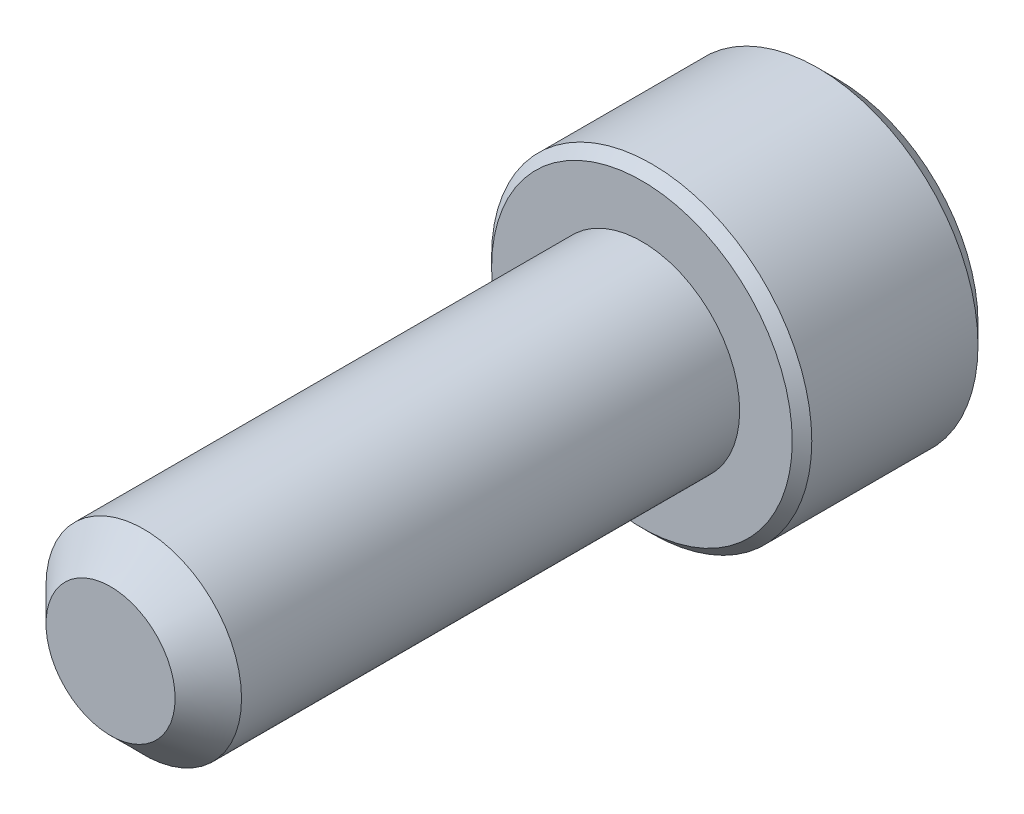
ISO-10303-21;
HEADER;
FILE_DESCRIPTION(('STEP AP214'),'2;1');
FILE_NAME('part.step','',(''),(''),'','','');
FILE_SCHEMA(('AUTOMOTIVE_DESIGN { 1 0 10303 214 1 1 1 1 }'));
ENDSEC;
DATA;
#1=APPLICATION_CONTEXT('core data for automotive mechanical design processes');
#2=APPLICATION_PROTOCOL_DEFINITION('international standard','automotive_design',2000,#1);
#3=PRODUCT_CONTEXT('',#1,'mechanical');
#4=PRODUCT('Part','Part','',(#3));
#5=PRODUCT_RELATED_PRODUCT_CATEGORY('part','',(#4));
#6=PRODUCT_DEFINITION_FORMATION('','',#4);
#7=PRODUCT_DEFINITION_CONTEXT('part definition',#1,'design');
#8=PRODUCT_DEFINITION('design','',#6,#7);
#9=PRODUCT_DEFINITION_SHAPE('','',#8);
#10=(LENGTH_UNIT() NAMED_UNIT(*) SI_UNIT(.MILLI.,.METRE.));
#11=(NAMED_UNIT(*) PLANE_ANGLE_UNIT() SI_UNIT($,.RADIAN.));
#12=(NAMED_UNIT(*) SI_UNIT($,.STERADIAN.) SOLID_ANGLE_UNIT());
#13=UNCERTAINTY_MEASURE_WITH_UNIT(LENGTH_MEASURE(1.E-05),#10,'distance_accuracy_value','');
#14=(GEOMETRIC_REPRESENTATION_CONTEXT(3) GLOBAL_UNCERTAINTY_ASSIGNED_CONTEXT((#13)) GLOBAL_UNIT_ASSIGNED_CONTEXT((#10,
#11,#12)) REPRESENTATION_CONTEXT('',''));
#15=CARTESIAN_POINT('',(0.,0.,0.));
#16=DIRECTION('',(0.,0.,1.));
#17=DIRECTION('',(1.,0.,0.));
#18=AXIS2_PLACEMENT_3D('',#15,#16,#17);
#19=CARTESIAN_POINT('',(0.,0.,-9.525));
#20=DIRECTION('',(0.,0.,1.));
#21=DIRECTION('',(1.,0.,0.));
#22=AXIS2_PLACEMENT_3D('',#19,#20,#21);
#23=CYLINDRICAL_SURFACE('',#22,1.7526);
#24=CARTESIAN_POINT('',(0.,0.,-0.595312499999999));
#25=DIRECTION('',(0.,0.,1.));
#26=DIRECTION('',(1.,0.,0.));
#27=AXIS2_PLACEMENT_3D('',#24,#25,#26);
#28=CIRCLE('',#27,1.7526);
#29=CARTESIAN_POINT('',(1.7526,0.,-0.5953125));
#30=VERTEX_POINT('',#29);
#31=EDGE_CURVE('E113',#30,#30,#28,.F.);
#32=CARTESIAN_POINT('',(0.,0.,-9.525));
#33=DIRECTION('',(0.,0.,-1.));
#34=DIRECTION('',(-1.,0.,0.));
#35=AXIS2_PLACEMENT_3D('',#32,#33,#34);
#36=CIRCLE('',#35,1.7526);
#37=CARTESIAN_POINT('',(1.7526,0.,-9.525));
#38=VERTEX_POINT('',#37);
#39=EDGE_CURVE('E213',#38,#38,#36,.F.);
#40=CARTESIAN_POINT('',(1.7526,0.,-0.5953125));
#41=CARTESIAN_POINT('',(1.7526,0.,-0.688330078125));
#42=CARTESIAN_POINT('',(1.7526,0.,-0.78134765625));
#43=CARTESIAN_POINT('',(1.7526,0.,-0.967382812500001));
#44=CARTESIAN_POINT('',(1.7526,0.,-1.060400390625));
#45=CARTESIAN_POINT('',(1.7526,0.,-1.246435546875));
#46=CARTESIAN_POINT('',(1.7526,0.,-1.339453125));
#47=CARTESIAN_POINT('',(1.7526,0.,-1.52548828125));
#48=CARTESIAN_POINT('',(1.7526,0.,-1.618505859375));
#49=CARTESIAN_POINT('',(1.7526,0.,-1.804541015625));
#50=CARTESIAN_POINT('',(1.7526,0.,-1.89755859375));
#51=CARTESIAN_POINT('',(1.7526,0.,-2.08359375));
#52=CARTESIAN_POINT('',(1.7526,0.,-2.176611328125));
#53=CARTESIAN_POINT('',(1.7526,0.,-2.362646484375));
#54=CARTESIAN_POINT('',(1.7526,0.,-2.4556640625));
#55=CARTESIAN_POINT('',(1.7526,0.,-2.64169921875));
#56=CARTESIAN_POINT('',(1.7526,0.,-2.734716796875));
#57=CARTESIAN_POINT('',(1.7526,0.,-2.920751953125));
#58=CARTESIAN_POINT('',(1.7526,0.,-3.01376953125));
#59=CARTESIAN_POINT('',(1.7526,0.,-3.1998046875));
#60=CARTESIAN_POINT('',(1.7526,0.,-3.292822265625));
#61=CARTESIAN_POINT('',(1.7526,0.,-3.478857421875));
#62=CARTESIAN_POINT('',(1.7526,0.,-3.571875));
#63=CARTESIAN_POINT('',(1.7526,0.,-3.75791015625));
#64=CARTESIAN_POINT('',(1.7526,0.,-3.850927734375));
#65=CARTESIAN_POINT('',(1.7526,0.,-4.036962890625));
#66=CARTESIAN_POINT('',(1.7526,0.,-4.12998046875));
#67=CARTESIAN_POINT('',(1.7526,0.,-4.316015625));
#68=CARTESIAN_POINT('',(1.7526,0.,-4.409033203125));
#69=CARTESIAN_POINT('',(1.7526,0.,-4.595068359375));
#70=CARTESIAN_POINT('',(1.7526,0.,-4.6880859375));
#71=CARTESIAN_POINT('',(1.7526,0.,-4.87412109375));
#72=CARTESIAN_POINT('',(1.7526,0.,-4.967138671875));
#73=CARTESIAN_POINT('',(1.7526,0.,-5.153173828125));
#74=CARTESIAN_POINT('',(1.7526,0.,-5.24619140625));
#75=CARTESIAN_POINT('',(1.7526,0.,-5.4322265625));
#76=CARTESIAN_POINT('',(1.7526,0.,-5.525244140625));
#77=CARTESIAN_POINT('',(1.7526,0.,-5.711279296875));
#78=CARTESIAN_POINT('',(1.7526,0.,-5.804296875));
#79=CARTESIAN_POINT('',(1.7526,0.,-5.99033203125));
#80=CARTESIAN_POINT('',(1.7526,0.,-6.083349609375));
#81=CARTESIAN_POINT('',(1.7526,0.,-6.269384765625));
#82=CARTESIAN_POINT('',(1.7526,0.,-6.36240234375));
#83=CARTESIAN_POINT('',(1.7526,0.,-6.5484375));
#84=CARTESIAN_POINT('',(1.7526,0.,-6.641455078125));
#85=CARTESIAN_POINT('',(1.7526,0.,-6.827490234375));
#86=CARTESIAN_POINT('',(1.7526,0.,-6.9205078125));
#87=CARTESIAN_POINT('',(1.7526,0.,-7.10654296875));
#88=CARTESIAN_POINT('',(1.7526,0.,-7.199560546875));
#89=CARTESIAN_POINT('',(1.7526,0.,-7.385595703125));
#90=CARTESIAN_POINT('',(1.7526,0.,-7.47861328125));
#91=CARTESIAN_POINT('',(1.7526,0.,-7.6646484375));
#92=CARTESIAN_POINT('',(1.7526,0.,-7.757666015625));
#93=CARTESIAN_POINT('',(1.7526,0.,-7.943701171875));
#94=CARTESIAN_POINT('',(1.7526,0.,-8.03671875));
#95=CARTESIAN_POINT('',(1.7526,0.,-8.22275390625));
#96=CARTESIAN_POINT('',(1.7526,0.,-8.315771484375));
#97=CARTESIAN_POINT('',(1.7526,0.,-8.501806640625));
#98=CARTESIAN_POINT('',(1.7526,0.,-8.59482421875));
#99=CARTESIAN_POINT('',(1.7526,0.,-8.780859375));
#100=CARTESIAN_POINT('',(1.7526,0.,-8.873876953125));
#101=CARTESIAN_POINT('',(1.7526,0.,-9.059912109375));
#102=CARTESIAN_POINT('',(1.7526,0.,-9.1529296875));
#103=CARTESIAN_POINT('',(1.7526,0.,-9.33896484375));
#104=CARTESIAN_POINT('',(1.7526,0.,-9.431982421875));
#105=CARTESIAN_POINT('',(1.7526,0.,-9.525));
#106=B_SPLINE_CURVE_WITH_KNOTS('',3,(#40,#41,#42,#43,#44,#45,#46,#47,#48,#49,#50,#51,#52,#53,
#54,#55,#56,#57,#58,#59,#60,#61,#62,#63,#64,#65,#66,#67,#68,#69,#70,#71,#72,#73,#74,#75,#76,#77,
#78,#79,#80,#81,#82,#83,#84,#85,#86,#87,#88,#89,#90,#91,#92,#93,#94,#95,#96,#97,#98,#99,#100,
#101,#102,#103,#104,#105),.UNSPECIFIED.,.F.,.F.,(4,2,2,2,2,2,2,2,2,2,2,2,2,2,2,2,2,2,2,2,2,2,2,
2,2,2,2,2,2,2,2,2,4),(0.,0.279052734375,0.55810546875,0.837158203125,1.1162109375,
1.395263671875,1.67431640625,1.953369140625,2.232421875,2.511474609375,2.79052734375,
3.069580078125,3.3486328125,3.627685546875,3.90673828125,4.185791015625,4.46484375,
4.743896484375,5.02294921875,5.302001953125,5.5810546875,5.860107421875,6.13916015625,
6.418212890625,6.697265625,6.976318359375,7.25537109375,7.534423828125,7.8134765625,
8.092529296875,8.37158203125,8.650634765625,8.9296875),.UNSPECIFIED.);
#107=EDGE_CURVE('BSEAM39',#30,#38,#106,.T.);
#108=ORIENTED_EDGE('',*,*,#31,.T.);
#109=ORIENTED_EDGE('',*,*,#39,.T.);
#110=ORIENTED_EDGE('',*,*,#107,.T.);
#111=ORIENTED_EDGE('',*,*,#107,.F.);
#112=EDGE_LOOP('',(#108,#110,#109,#111));
#113=FACE_BOUND('',#112,.T.);
#114=ADVANCED_FACE('F39',(#113),#23,.T.);
#115=CARTESIAN_POINT('',(0.,0.,0.));
#116=DIRECTION('',(0.,0.,1.));
#117=DIRECTION('',(1.,0.,0.));
#118=AXIS2_PLACEMENT_3D('',#115,#116,#117);
#119=PLANE('',#118);
#120=CARTESIAN_POINT('',(0.,0.,0.));
#121=DIRECTION('',(0.,0.,1.));
#122=DIRECTION('',(1.,0.,0.));
#123=AXIS2_PLACEMENT_3D('',#120,#121,#122);
#124=CIRCLE('',#123,1.1572875);
#125=CARTESIAN_POINT('',(1.1572875,0.,0.));
#126=VERTEX_POINT('',#125);
#127=EDGE_CURVE('E212',#126,#126,#124,.T.);
#128=ORIENTED_EDGE('',*,*,#127,.T.);
#129=EDGE_LOOP('',(#128));
#130=FACE_BOUND('',#129,.T.);
#131=ADVANCED_FACE('F190',(#130),#119,.T.);
#132=CARTESIAN_POINT('',(0.,0.,0.));
#133=DIRECTION('',(0.,0.,-1.));
#134=DIRECTION('',(-1.,0.,0.));
#135=AXIS2_PLACEMENT_3D('',#132,#133,#134);
#136=CONICAL_SURFACE('',#135,1.1572875,0.78539816339745);
#137=ORIENTED_EDGE('',*,*,#31,.F.);
#138=EDGE_LOOP('',(#137));
#139=FACE_BOUND('',#138,.T.);
#140=ORIENTED_EDGE('',*,*,#127,.F.);
#141=EDGE_LOOP('',(#140));
#142=FACE_BOUND('',#141,.T.);
#143=ADVANCED_FACE('F196',(#139,#142),#136,.T.);
#144=CARTESIAN_POINT('',(0.,0.,-13.0302));
#145=DIRECTION('',(0.,0.,1.));
#146=DIRECTION('',(1.,0.,0.));
#147=AXIS2_PLACEMENT_3D('',#144,#145,#146);
#148=CYLINDRICAL_SURFACE('',#147,2.8702);
#149=CARTESIAN_POINT('',(0.,0.,-9.70026));
#150=DIRECTION('',(0.,0.,-1.));
#151=DIRECTION('',(-1.,0.,0.));
#152=AXIS2_PLACEMENT_3D('',#149,#150,#151);
#153=CIRCLE('',#152,2.8702);
#154=CARTESIAN_POINT('',(-2.8702,0.,-9.70026));
#155=VERTEX_POINT('',#154);
#156=EDGE_CURVE('E47',#155,#155,#153,.T.);
#157=ORIENTED_EDGE('',*,*,#156,.T.);
#158=EDGE_LOOP('',(#157));
#159=FACE_BOUND('',#158,.T.);
#160=CARTESIAN_POINT('',(0.,0.,-12.67968));
#161=DIRECTION('',(0.,0.,-1.));
#162=DIRECTION('',(-1.,0.,0.));
#163=AXIS2_PLACEMENT_3D('',#160,#161,#162);
#164=CIRCLE('',#163,2.8702);
#165=CARTESIAN_POINT('',(-2.8702,0.,-12.67968));
#166=VERTEX_POINT('',#165);
#167=EDGE_CURVE('E173',#166,#166,#164,.F.);
#168=ORIENTED_EDGE('',*,*,#167,.T.);
#169=EDGE_LOOP('',(#168));
#170=FACE_BOUND('',#169,.T.);
#171=ADVANCED_FACE('F178',(#159,#170),#148,.T.);
#172=CARTESIAN_POINT('',(0.,0.,-13.0302));
#173=DIRECTION('',(0.,0.,-1.));
#174=DIRECTION('',(-1.,0.,0.));
#175=AXIS2_PLACEMENT_3D('',#172,#173,#174);
#176=PLANE('',#175);
#177=CARTESIAN_POINT('',(0.,0.,-13.0302));
#178=DIRECTION('',(0.,0.,-1.));
#179=DIRECTION('',(-1.,0.,0.));
#180=AXIS2_PLACEMENT_3D('',#177,#178,#179);
#181=CIRCLE('',#180,2.51968);
#182=CARTESIAN_POINT('',(-2.51968,0.,-13.0302));
#183=VERTEX_POINT('',#182);
#184=EDGE_CURVE('E112',#183,#183,#181,.T.);
#185=ORIENTED_EDGE('',*,*,#184,.T.);
#186=EDGE_LOOP('',(#185));
#187=FACE_BOUND('',#186,.T.);
#188=CARTESIAN_POINT('',(0.,0.,-13.0302));
#189=DIRECTION('',(0.,0.,-1.));
#190=DIRECTION('',(-1.,0.,0.));
#191=AXIS2_PLACEMENT_3D('',#188,#189,#190);
#192=CIRCLE('',#191,1.60395121659243);
#193=CARTESIAN_POINT('',(-1.3890625,0.801975608296217,-13.0302));
#194=VERTEX_POINT('',#193);
#195=CARTESIAN_POINT('',(0.,1.60395121659243,-13.0302));
#196=VERTEX_POINT('',#195);
#197=EDGE_CURVE('E93',#194,#196,#192,.T.);
#198=ORIENTED_EDGE('',*,*,#197,.F.);
#199=CARTESIAN_POINT('',(-1.3890625,-0.801975608296215,-13.0302));
#200=VERTEX_POINT('',#199);
#201=EDGE_CURVE('E53',#200,#194,#192,.T.);
#202=ORIENTED_EDGE('',*,*,#201,.F.);
#203=CARTESIAN_POINT('',(0.,-1.60395121659243,-13.0302));
#204=VERTEX_POINT('',#203);
#205=EDGE_CURVE('E269',#204,#200,#192,.T.);
#206=ORIENTED_EDGE('',*,*,#205,.F.);
#207=CARTESIAN_POINT('',(1.3890625,-0.801975608296215,-13.0302));
#208=VERTEX_POINT('',#207);
#209=EDGE_CURVE('E60',#208,#204,#192,.T.);
#210=ORIENTED_EDGE('',*,*,#209,.F.);
#211=CARTESIAN_POINT('',(1.3890625,0.801975608296215,-13.0302));
#212=VERTEX_POINT('',#211);
#213=EDGE_CURVE('E134',#212,#208,#192,.T.);
#214=ORIENTED_EDGE('',*,*,#213,.F.);
#215=EDGE_CURVE('E102',#196,#212,#192,.T.);
#216=ORIENTED_EDGE('',*,*,#215,.F.);
#217=EDGE_LOOP('',(#198,#202,#206,#210,#214,#216));
#218=FACE_BOUND('',#217,.T.);
#219=ADVANCED_FACE('F133',(#187,#218),#176,.T.);
#220=CARTESIAN_POINT('',(0.,0.,-9.525));
#221=DIRECTION('',(0.,0.,-1.));
#222=DIRECTION('',(-1.,0.,0.));
#223=AXIS2_PLACEMENT_3D('',#220,#221,#222);
#224=PLANE('',#223);
#225=CARTESIAN_POINT('',(0.,0.,-9.525));
#226=DIRECTION('',(0.,0.,-1.));
#227=DIRECTION('',(-1.,0.,0.));
#228=AXIS2_PLACEMENT_3D('',#225,#226,#227);
#229=CIRCLE('',#228,2.69494);
#230=CARTESIAN_POINT('',(-2.69494,0.,-9.525));
#231=VERTEX_POINT('',#230);
#232=EDGE_CURVE('E12',#231,#231,#229,.F.);
#233=ORIENTED_EDGE('',*,*,#232,.T.);
#234=EDGE_LOOP('',(#233));
#235=FACE_BOUND('',#234,.T.);
#236=ORIENTED_EDGE('',*,*,#39,.F.);
#237=EDGE_LOOP('',(#236));
#238=FACE_BOUND('',#237,.T.);
#239=ADVANCED_FACE('F281',(#235,#238),#224,.F.);
#240=CARTESIAN_POINT('',(0.,0.,-13.0302));
#241=DIRECTION('',(0.,0.,-1.));
#242=DIRECTION('',(-1.,0.,0.));
#243=AXIS2_PLACEMENT_3D('',#240,#241,#242);
#244=CONICAL_SURFACE('',#243,1.60395121659243,0.78539816339745);
#245=ORIENTED_EDGE('',*,*,#215,.T.);
#246=CARTESIAN_POINT('',(-0.000199999999999933,1.60406668664627,-13.0303154825221));
#247=CARTESIAN_POINT('',(0.047554814899586,1.57649543140889,-13.0027647868811));
#248=CARTESIAN_POINT('',(0.0961082129767677,1.54846311395896,-12.9768319141145));
#249=CARTESIAN_POINT('',(0.195114281423184,1.49130193369001,-12.9293489608708));
#250=CARTESIAN_POINT('',(0.245576372730141,1.46216763169007,-12.9078253080794));
#251=CARTESIAN_POINT('',(0.34733083528491,1.40341966534283,-12.8709546019866));
#252=CARTESIAN_POINT('',(0.398597278416376,1.37382097060048,-12.8555148513149));
#253=CARTESIAN_POINT('',(0.502259069123939,1.31397180783079,-12.8317264581829));
#254=CARTESIAN_POINT('',(0.554651247789433,1.28372316937484,-12.8233600517165));
#255=CARTESIAN_POINT('',(0.644944084544836,1.23159257576821,-12.8158113663708));
#256=CARTESIAN_POINT('',(0.682728034255603,1.20977800223165,-12.8146936971037));
#257=CARTESIAN_POINT('',(0.758229287800439,1.16618733317339,-12.8165750513552));
#258=CARTESIAN_POINT('',(0.79594657508652,1.14441124720567,-12.8195749834252));
#259=CARTESIAN_POINT('',(0.871018018906522,1.10106872890773,-12.8295189567457));
#260=CARTESIAN_POINT('',(0.908371804329555,1.07950251083849,-12.8364666704902));
#261=CARTESIAN_POINT('',(0.982452435596042,1.03673203843505,-12.8539288810594));
#262=CARTESIAN_POINT('',(1.01917900521513,1.01552794357906,-12.8644449088769));
#263=CARTESIAN_POINT('',(1.11325413716704,0.961213640822577,-12.8956664203823));
#264=CARTESIAN_POINT('',(1.17001916310317,0.928440337817793,-12.9187263608604));
#265=CARTESIAN_POINT('',(1.25348479270274,0.880251434100402,-12.9576547118295));
#266=CARTESIAN_POINT('',(1.28098915116073,0.86437178534079,-12.9713318145832));
#267=CARTESIAN_POINT('',(1.33549195495674,0.832904576897576,-12.9999348081189));
#268=CARTESIAN_POINT('',(1.36249063449213,0.817316882000055,-13.0148601023926));
#269=CARTESIAN_POINT('',(1.3892625,0.801860138242377,-13.0303154825221));
#270=B_SPLINE_CURVE_WITH_KNOTS('',3,(#246,#247,#248,#249,#250,#251,#252,#253,#254,#255,#256,
#257,#258,#259,#260,#261,#262,#263,#264,#265,#266,#267,#268,#269),.UNSPECIFIED.,.F.,.F.,(4,2,2,
2,2,2,2,2,2,2,2,4),(0.,0.185054161583332,0.371186974731966,0.554362620151554,0.737076859824674,
0.867821902366108,0.998595798526819,1.12949154907137,1.26044353188444,1.46846066168042,
1.57218026599104,1.67585058309997),.UNSPECIFIED.);
#271=EDGE_CURVE('E107',#196,#212,#270,.T.);
#272=ORIENTED_EDGE('',*,*,#271,.F.);
#273=EDGE_LOOP('',(#245,#272));
#274=FACE_BOUND('',#273,.T.);
#275=ADVANCED_FACE('F108',(#274),#244,.F.);
#276=ORIENTED_EDGE('',*,*,#213,.T.);
#277=CARTESIAN_POINT('',(1.3890625,-1.61940394480745,-13.5597819482223));
#278=CARTESIAN_POINT('',(1.3890625,-1.58006115349146,-13.5299243271923));
#279=CARTESIAN_POINT('',(1.3890625,-1.54050132955006,-13.5003535181349));
#280=CARTESIAN_POINT('',(1.3890625,-1.46085876241779,-13.4419045446385));
#281=CARTESIAN_POINT('',(1.3890625,-1.42077589246553,-13.4130265531062));
#282=CARTESIAN_POINT('',(1.3890625,-1.29902274997118,-13.3271982113368));
#283=CARTESIAN_POINT('',(1.3890625,-1.21644571524143,-13.2715129842253));
#284=CARTESIAN_POINT('',(1.3890625,-1.04315507977619,-13.1620119606919));
#285=CARTESIAN_POINT('',(1.3890625,-0.95224847619391,-13.108498197639));
#286=CARTESIAN_POINT('',(1.3890625,-0.765869525131634,-13.0104818620338));
#287=CARTESIAN_POINT('',(1.3890625,-0.670413981853177,-12.9659488871386));
#288=CARTESIAN_POINT('',(1.3890625,-0.527324185824117,-12.9114610332753));
#289=CARTESIAN_POINT('',(1.3890625,-0.481850777039664,-12.8958565157759));
#290=CARTESIAN_POINT('',(1.3890625,-0.389788715477722,-12.8682958930187));
#291=CARTESIAN_POINT('',(1.3890625,-0.343199987774419,-12.8563400336195));
#292=CARTESIAN_POINT('',(1.3890625,-0.249973786412085,-12.8369026508989));
#293=CARTESIAN_POINT('',(1.3890625,-0.20335281289058,-12.8293432373455));
#294=CARTESIAN_POINT('',(1.3890625,-0.109590268814354,-12.8188495716361));
#295=CARTESIAN_POINT('',(1.3890625,-0.0624487940539228,-12.8159144822393));
#296=CARTESIAN_POINT('',(1.3890625,0.0300876528594525,-12.8148959870312));
#297=CARTESIAN_POINT('',(1.3890625,0.0754806899085078,-12.8166318778689));
#298=CARTESIAN_POINT('',(1.3890625,0.165887420036846,-12.8244562074487));
#299=CARTESIAN_POINT('',(1.3890625,0.210901076451831,-12.8305450621007));
#300=CARTESIAN_POINT('',(1.3890625,0.300985584808154,-12.8468429071109));
#301=CARTESIAN_POINT('',(1.3890625,0.346043426477338,-12.8571227134166));
#302=CARTESIAN_POINT('',(1.3890625,0.435171985795334,-12.8812501165965));
#303=CARTESIAN_POINT('',(1.3890625,0.479242778772563,-12.8950974401937));
#304=CARTESIAN_POINT('',(1.3890625,0.617097855137388,-12.9436456952925));
#305=CARTESIAN_POINT('',(1.3890625,0.708943143387237,-12.9838382623019));
#306=CARTESIAN_POINT('',(1.3890625,0.888326863327376,-13.0732263268257));
#307=CARTESIAN_POINT('',(1.3890625,0.97584844310253,-13.1224539890072));
#308=CARTESIAN_POINT('',(1.3890625,1.14312734298093,-13.224041791674));
#309=CARTESIAN_POINT('',(1.3890625,1.22305448923177,-13.2761257684336));
#310=CARTESIAN_POINT('',(1.3890625,1.3408107215704,-13.3566537579098));
#311=CARTESIAN_POINT('',(1.3890625,1.37955507371222,-13.3837826125004));
#312=CARTESIAN_POINT('',(1.3890625,1.4565136416918,-13.43876083201));
#313=CARTESIAN_POINT('',(1.3890625,1.49472800051002,-13.4666099965591));
#314=CARTESIAN_POINT('',(1.3890625,1.53272159252287,-13.494757934727));
#315=B_SPLINE_CURVE_WITH_KNOTS('',3,(#277,#278,#279,#280,#281,#282,#283,#284,#285,#286,#287,
#288,#289,#290,#291,#292,#293,#294,#295,#296,#297,#298,#299,#300,#301,#302,#303,#304,#305,#306,
#307,#308,#309,#310,#311,#312,#313,#314),.UNSPECIFIED.,.F.,.F.,(4,2,2,2,2,2,2,2,2,2,2,2,2,2,2,2,
2,2,4),(0.,0.148165097735296,0.296366796320977,0.595030749860533,0.9112413269151,
1.22636278192646,1.37047020890679,1.51458734417271,1.65606664391464,1.79752032566969,
1.93358111293095,2.06965490204564,2.20813012759239,2.34659474888992,2.64647835597473,
2.94745101021194,3.23350725563862,3.37539574691567,3.51724518455275),.UNSPECIFIED.);
#316=EDGE_CURVE('E101',#212,#208,#315,.F.);
#317=ORIENTED_EDGE('',*,*,#316,.F.);
#318=EDGE_LOOP('',(#276,#317));
#319=FACE_BOUND('',#318,.T.);
#320=ADVANCED_FACE('F275',(#319),#244,.F.);
#321=ORIENTED_EDGE('',*,*,#209,.T.);
#322=CARTESIAN_POINT('',(1.3892625,-0.801860138242376,-13.0303154825221));
#323=CARTESIAN_POINT('',(1.34150768510041,-0.829431393479753,-13.0027647868811));
#324=CARTESIAN_POINT('',(1.29295428702323,-0.857463710929685,-12.9768319141145));
#325=CARTESIAN_POINT('',(1.19394821857681,-0.91462489119863,-12.9293489608708));
#326=CARTESIAN_POINT('',(1.14348612726986,-0.943759193198573,-12.9078253080794));
#327=CARTESIAN_POINT('',(1.04173166471509,-1.00250715954581,-12.8709546019866));
#328=CARTESIAN_POINT('',(0.990465221583623,-1.03210585428816,-12.8555148513149));
#329=CARTESIAN_POINT('',(0.88680343087606,-1.09195501705785,-12.8317264581829));
#330=CARTESIAN_POINT('',(0.834411252210565,-1.12220365551381,-12.8233600517165));
#331=CARTESIAN_POINT('',(0.744118415455162,-1.17433424912043,-12.8158113663708));
#332=CARTESIAN_POINT('',(0.706334465744396,-1.19614882265699,-12.8146936971037));
#333=CARTESIAN_POINT('',(0.63083321219956,-1.23973949171526,-12.8165750513552));
#334=CARTESIAN_POINT('',(0.593115924913479,-1.26151557768298,-12.8195749834252));
#335=CARTESIAN_POINT('',(0.518044481093477,-1.30485809598091,-12.8295189567457));
#336=CARTESIAN_POINT('',(0.480690695670444,-1.32642431405015,-12.8364666704902));
#337=CARTESIAN_POINT('',(0.406610064403957,-1.36919478645359,-12.8539288810594));
#338=CARTESIAN_POINT('',(0.369883494784869,-1.39039888130959,-12.8644449088769));
#339=CARTESIAN_POINT('',(0.275808362832963,-1.44471318406607,-12.8956664203823));
#340=CARTESIAN_POINT('',(0.219043336896829,-1.47748648707085,-12.9187263608604));
#341=CARTESIAN_POINT('',(0.135577707297262,-1.52567539078824,-12.9576547118295));
#342=CARTESIAN_POINT('',(0.108073348839266,-1.54155503954785,-12.9713318145832));
#343=CARTESIAN_POINT('',(0.0535705450432604,-1.57302224799107,-12.9999348081189));
#344=CARTESIAN_POINT('',(0.0265718655078724,-1.58860994288859,-13.0148601023926));
#345=CARTESIAN_POINT('',(-0.000200000000000021,-1.60406668664627,-13.0303154825221));
#346=B_SPLINE_CURVE_WITH_KNOTS('',3,(#322,#323,#324,#325,#326,#327,#328,#329,#330,#331,#332,
#333,#334,#335,#336,#337,#338,#339,#340,#341,#342,#343,#344,#345),.UNSPECIFIED.,.F.,.F.,(4,2,2,
2,2,2,2,2,2,2,2,4),(0.,0.185054161583333,0.371186974731967,0.554362620151556,0.737076859824676,
0.86782190236611,0.998595798526821,1.12949154907137,1.26044353188444,1.46846066168042,
1.57218026599104,1.67585058309997),.UNSPECIFIED.);
#347=EDGE_CURVE('E143',#208,#204,#346,.T.);
#348=ORIENTED_EDGE('',*,*,#347,.F.);
#349=EDGE_LOOP('',(#321,#348));
#350=FACE_BOUND('',#349,.T.);
#351=ADVANCED_FACE('F272',(#350),#244,.F.);
#352=ORIENTED_EDGE('',*,*,#205,.T.);
#353=CARTESIAN_POINT('',(0.000200000000000373,-1.60406668664627,-13.0303154825221));
#354=CARTESIAN_POINT('',(-0.0475548148995854,-1.57649543140889,-13.0027647868811));
#355=CARTESIAN_POINT('',(-0.0961082129767673,-1.54846311395896,-12.9768319141145));
#356=CARTESIAN_POINT('',(-0.195114281423185,-1.49130193369001,-12.9293489608708));
#357=CARTESIAN_POINT('',(-0.245576372730142,-1.46216763169007,-12.9078253080794));
#358=CARTESIAN_POINT('',(-0.347330835284911,-1.40341966534283,-12.8709546019866));
#359=CARTESIAN_POINT('',(-0.398597278416377,-1.37382097060048,-12.8555148513149));
#360=CARTESIAN_POINT('',(-0.50225906912394,-1.31397180783079,-12.8317264581829));
#361=CARTESIAN_POINT('',(-0.554651247789434,-1.28372316937484,-12.8233600517165));
#362=CARTESIAN_POINT('',(-0.644944084544837,-1.23159257576821,-12.8158113663708));
#363=CARTESIAN_POINT('',(-0.682728034255603,-1.20977800223165,-12.8146936971037));
#364=CARTESIAN_POINT('',(-0.75822928780044,-1.16618733317339,-12.8165750513552));
#365=CARTESIAN_POINT('',(-0.795946575086521,-1.14441124720567,-12.8195749834252));
#366=CARTESIAN_POINT('',(-0.871018018906523,-1.10106872890773,-12.8295189567457));
#367=CARTESIAN_POINT('',(-0.908371804329556,-1.07950251083849,-12.8364666704902));
#368=CARTESIAN_POINT('',(-0.982452435596043,-1.03673203843505,-12.8539288810594));
#369=CARTESIAN_POINT('',(-1.01917900521513,-1.01552794357906,-12.8644449088769));
#370=CARTESIAN_POINT('',(-1.11325413716704,-0.961213640822576,-12.8956664203823));
#371=CARTESIAN_POINT('',(-1.17001916310317,-0.928440337817793,-12.9187263608604));
#372=CARTESIAN_POINT('',(-1.25348479270274,-0.880251434100402,-12.9576547118295));
#373=CARTESIAN_POINT('',(-1.28098915116073,-0.864371785340789,-12.9713318145832));
#374=CARTESIAN_POINT('',(-1.33549195495674,-0.832904576897576,-12.9999348081189));
#375=CARTESIAN_POINT('',(-1.36249063449213,-0.817316882000055,-13.0148601023926));
#376=CARTESIAN_POINT('',(-1.3892625,-0.801860138242377,-13.0303154825221));
#377=B_SPLINE_CURVE_WITH_KNOTS('',3,(#353,#354,#355,#356,#357,#358,#359,#360,#361,#362,#363,
#364,#365,#366,#367,#368,#369,#370,#371,#372,#373,#374,#375,#376),.UNSPECIFIED.,.F.,.F.,(4,2,2,
2,2,2,2,2,2,2,2,4),(0.,0.185054161583333,0.371186974731968,0.554362620151556,0.737076859824676,
0.86782190236611,0.998595798526821,1.12949154907137,1.26044353188444,1.46846066168042,
1.57218026599104,1.67585058309997),.UNSPECIFIED.);
#378=EDGE_CURVE('E247',#204,#200,#377,.T.);
#379=ORIENTED_EDGE('',*,*,#378,.F.);
#380=EDGE_LOOP('',(#352,#379));
#381=FACE_BOUND('',#380,.T.);
#382=ADVANCED_FACE('F271',(#381),#244,.F.);
#383=ORIENTED_EDGE('',*,*,#201,.T.);
#384=CARTESIAN_POINT('',(-1.3890625,-1.61940394489368,-13.5597819482877));
#385=CARTESIAN_POINT('',(-1.3890625,-1.58006115357525,-13.5299243272552));
#386=CARTESIAN_POINT('',(-1.3890625,-1.54050132963141,-13.5003535181953));
#387=CARTESIAN_POINT('',(-1.3890625,-1.46085876249422,-13.4419045446939));
#388=CARTESIAN_POINT('',(-1.3890625,-1.42077589253949,-13.4130265531591));
#389=CARTESIAN_POINT('',(-1.3890625,-1.29902275003757,-13.3271982113821));
#390=CARTESIAN_POINT('',(-1.3890625,-1.21644571530268,-13.2715129842656));
#391=CARTESIAN_POINT('',(-1.3890625,-1.04315507982623,-13.1620119607219));
#392=CARTESIAN_POINT('',(-1.3890625,-0.952248476237843,-13.1084981976636));
#393=CARTESIAN_POINT('',(-1.3890625,-0.765869525162843,-13.0104818620486));
#394=CARTESIAN_POINT('',(-1.3890625,-0.670413981877769,-12.965948887149));
#395=CARTESIAN_POINT('',(-1.3890625,-0.52732418584374,-12.9114610332824));
#396=CARTESIAN_POINT('',(-1.3890625,-0.481850777061388,-12.8958565157831));
#397=CARTESIAN_POINT('',(-1.3890625,-0.389788715503718,-12.8682958930258));
#398=CARTESIAN_POINT('',(-1.3890625,-0.343199987802588,-12.8563400336264));
#399=CARTESIAN_POINT('',(-1.3890625,-0.249973786444529,-12.8369026509047));
#400=CARTESIAN_POINT('',(-1.3890625,-0.203352812925126,-12.8293432373505));
#401=CARTESIAN_POINT('',(-1.3890625,-0.109590268853037,-12.8188495716392));
#402=CARTESIAN_POINT('',(-1.3890625,-0.0624487940946406,-12.8159144822412));
#403=CARTESIAN_POINT('',(-1.3890625,0.0300876528150618,-12.8148959870303));
#404=CARTESIAN_POINT('',(-1.3890625,0.075480689862474,-12.8166318778665));
#405=CARTESIAN_POINT('',(-1.3890625,0.165887419987695,-12.8244562074429));
#406=CARTESIAN_POINT('',(-1.3890625,0.210901076401207,-12.8305450620931));
#407=CARTESIAN_POINT('',(-1.3890625,0.30098558475462,-12.8468429070996));
#408=CARTESIAN_POINT('',(-1.3890625,0.346043426422373,-12.8571227134034));
#409=CARTESIAN_POINT('',(-1.3890625,0.435171985737649,-12.8812501165793));
#410=CARTESIAN_POINT('',(-1.3890625,0.479242778713589,-12.8950974401745));
#411=CARTESIAN_POINT('',(-1.3890625,0.617097855065661,-12.9436456952639));
#412=CARTESIAN_POINT('',(-1.3890625,0.708943143304684,-12.9838382622647));
#413=CARTESIAN_POINT('',(-1.3890625,0.888326863224004,-13.0732263267703));
#414=CARTESIAN_POINT('',(-1.3890625,0.97584844298917,-13.1224539889421));
#415=CARTESIAN_POINT('',(-1.3890625,1.14312734284962,-13.2240417915907));
#416=CARTESIAN_POINT('',(-1.3890625,1.22305448909244,-13.2761257683416));
#417=CARTESIAN_POINT('',(-1.3890625,1.3408107214192,-13.3566537578048));
#418=CARTESIAN_POINT('',(-1.3890625,1.37955507355712,-13.3837826123911));
#419=CARTESIAN_POINT('',(-1.3890625,1.45651364152893,-13.4387608318921));
#420=CARTESIAN_POINT('',(-1.3890625,1.49472800034328,-13.4666099964369));
#421=CARTESIAN_POINT('',(-1.3890625,1.53272159235226,-13.4947579346005));
#422=B_SPLINE_CURVE_WITH_KNOTS('',3,(#384,#385,#386,#387,#388,#389,#390,#391,#392,#393,#394,
#395,#396,#397,#398,#399,#400,#401,#402,#403,#404,#405,#406,#407,#408,#409,#410,#411,#412,#413,
#414,#415,#416,#417,#418,#419,#420,#421),.UNSPECIFIED.,.F.,.F.,(4,2,2,2,2,2,2,2,2,2,2,2,2,2,2,2,
2,2,4),(0.,0.148165097745703,0.296366796341796,0.595030749902562,0.911241326980939,
1.22636278201588,1.37047020899011,1.51458734424995,1.65606664398604,1.79752032573526,
1.93358111299145,2.06965490210104,2.2081301276423,2.34659474893434,2.6464783559792,
2.9474510101762,3.2335072555685,3.37539574682859,3.51724518444871),.UNSPECIFIED.);
#423=EDGE_CURVE('E123',#200,#194,#422,.T.);
#424=ORIENTED_EDGE('',*,*,#423,.F.);
#425=EDGE_LOOP('',(#383,#424));
#426=FACE_BOUND('',#425,.T.);
#427=ADVANCED_FACE('F288',(#426),#244,.F.);
#428=ORIENTED_EDGE('',*,*,#197,.T.);
#429=CARTESIAN_POINT('',(-1.3892625,0.801860138242378,-13.0303154825221));
#430=CARTESIAN_POINT('',(-1.34150768510041,0.829431393479755,-13.0027647868811));
#431=CARTESIAN_POINT('',(-1.29295428702323,0.857463710929686,-12.9768319141145));
#432=CARTESIAN_POINT('',(-1.19394821857681,0.914624891198632,-12.9293489608708));
#433=CARTESIAN_POINT('',(-1.14348612726986,0.943759193198574,-12.9078253080794));
#434=CARTESIAN_POINT('',(-1.04173166471509,1.00250715954582,-12.8709546019866));
#435=CARTESIAN_POINT('',(-0.990465221583623,1.03210585428816,-12.8555148513149));
#436=CARTESIAN_POINT('',(-0.88680343087606,1.09195501705785,-12.8317264581829));
#437=CARTESIAN_POINT('',(-0.834411252210565,1.12220365551381,-12.8233600517165));
#438=CARTESIAN_POINT('',(-0.744118415455162,1.17433424912043,-12.8158113663708));
#439=CARTESIAN_POINT('',(-0.706334465744396,1.19614882265699,-12.8146936971037));
#440=CARTESIAN_POINT('',(-0.63083321219956,1.23973949171526,-12.8165750513552));
#441=CARTESIAN_POINT('',(-0.593115924913479,1.26151557768298,-12.8195749834252));
#442=CARTESIAN_POINT('',(-0.518044481093477,1.30485809598091,-12.8295189567457));
#443=CARTESIAN_POINT('',(-0.480690695670444,1.32642431405015,-12.8364666704902));
#444=CARTESIAN_POINT('',(-0.406610064403957,1.36919478645359,-12.8539288810594));
#445=CARTESIAN_POINT('',(-0.369883494784869,1.39039888130959,-12.8644449088769));
#446=CARTESIAN_POINT('',(-0.275808362832963,1.44471318406607,-12.8956664203823));
#447=CARTESIAN_POINT('',(-0.219043336896829,1.47748648707085,-12.9187263608604));
#448=CARTESIAN_POINT('',(-0.135577707297262,1.52567539078824,-12.9576547118295));
#449=CARTESIAN_POINT('',(-0.108073348839266,1.54155503954785,-12.9713318145832));
#450=CARTESIAN_POINT('',(-0.0535705450432599,1.57302224799107,-12.9999348081189));
#451=CARTESIAN_POINT('',(-0.0265718655078721,1.58860994288859,-13.0148601023926));
#452=CARTESIAN_POINT('',(0.000199999999999852,1.60406668664627,-13.0303154825221));
#453=B_SPLINE_CURVE_WITH_KNOTS('',3,(#429,#430,#431,#432,#433,#434,#435,#436,#437,#438,#439,
#440,#441,#442,#443,#444,#445,#446,#447,#448,#449,#450,#451,#452),.UNSPECIFIED.,.F.,.F.,(4,2,2,
2,2,2,2,2,2,2,2,4),(0.,0.185054161583333,0.371186974731966,0.554362620151554,0.737076859824674,
0.867821902366108,0.998595798526819,1.12949154907136,1.26044353188444,1.46846066168042,
1.57218026599103,1.67585058309997),.UNSPECIFIED.);
#454=EDGE_CURVE('E97',#194,#196,#453,.T.);
#455=ORIENTED_EDGE('',*,*,#454,.F.);
#456=EDGE_LOOP('',(#428,#455));
#457=FACE_BOUND('',#456,.T.);
#458=ADVANCED_FACE('F95',(#457),#244,.F.);
#459=CARTESIAN_POINT('',(1.3890625,2.40592682488864,-10.94660625));
#460=DIRECTION('',(0.,0.,-1.));
#461=DIRECTION('',(-1.,0.,0.));
#462=AXIS2_PLACEMENT_3D('',#459,#460,#461);
#463=PLANE('',#462);
#464=DIRECTION('',(0.866025403784439,0.5,0.));
#465=VECTOR('',#464,1.);
#466=CARTESIAN_POINT('',(-1.3890625,0.801975608296216,-10.94660625));
#467=LINE('',#466,#465);
#468=CARTESIAN_POINT('',(-1.3890625,0.801975608296216,-10.94660625));
#469=VERTEX_POINT('',#468);
#470=CARTESIAN_POINT('',(0.,1.60395121659243,-10.94660625));
#471=VERTEX_POINT('',#470);
#472=EDGE_CURVE('E122',#469,#471,#467,.T.);
#473=ORIENTED_EDGE('',*,*,#472,.T.);
#474=DIRECTION('',(0.866025403784439,-0.5,0.));
#475=VECTOR('',#474,1.);
#476=CARTESIAN_POINT('',(0.,1.60395121659243,-10.94660625));
#477=LINE('',#476,#475);
#478=CARTESIAN_POINT('',(1.3890625,0.801975608296215,-10.94660625));
#479=VERTEX_POINT('',#478);
#480=EDGE_CURVE('E127',#471,#479,#477,.T.);
#481=ORIENTED_EDGE('',*,*,#480,.T.);
#482=DIRECTION('',(0.,-1.,0.));
#483=VECTOR('',#482,1.);
#484=CARTESIAN_POINT('',(1.3890625,0.801975608296215,-10.94660625));
#485=LINE('',#484,#483);
#486=CARTESIAN_POINT('',(1.3890625,-0.801975608296214,-10.94660625));
#487=VERTEX_POINT('',#486);
#488=EDGE_CURVE('E235',#479,#487,#485,.T.);
#489=ORIENTED_EDGE('',*,*,#488,.T.);
#490=DIRECTION('',(-0.866025403784439,-0.5,0.));
#491=VECTOR('',#490,1.);
#492=CARTESIAN_POINT('',(1.3890625,-0.801975608296214,-10.94660625));
#493=LINE('',#492,#491);
#494=CARTESIAN_POINT('',(0.,-1.60395121659243,-10.94660625));
#495=VERTEX_POINT('',#494);
#496=EDGE_CURVE('E232',#487,#495,#493,.T.);
#497=ORIENTED_EDGE('',*,*,#496,.T.);
#498=DIRECTION('',(-0.866025403784439,0.5,0.));
#499=VECTOR('',#498,1.);
#500=CARTESIAN_POINT('',(0.,-1.60395121659243,-10.94660625));
#501=LINE('',#500,#499);
#502=CARTESIAN_POINT('',(-1.3890625,-0.801975608296215,-10.94660625));
#503=VERTEX_POINT('',#502);
#504=EDGE_CURVE('E229',#495,#503,#501,.T.);
#505=ORIENTED_EDGE('',*,*,#504,.T.);
#506=DIRECTION('',(0.,1.,0.));
#507=VECTOR('',#506,1.);
#508=CARTESIAN_POINT('',(-1.3890625,-0.801975608296215,-10.94660625));
#509=LINE('',#508,#507);
#510=EDGE_CURVE('E130',#503,#469,#509,.T.);
#511=ORIENTED_EDGE('',*,*,#510,.T.);
#512=EDGE_LOOP('',(#473,#481,#489,#497,#505,#511));
#513=FACE_BOUND('',#512,.T.);
#514=ADVANCED_FACE('F162',(#513),#463,.T.);
#515=CARTESIAN_POINT('',(0.,1.60395121659243,-10.94660625));
#516=DIRECTION('',(0.5,0.866025403784439,0.));
#517=DIRECTION('',(-0.866025403784439,0.5,0.));
#518=AXIS2_PLACEMENT_3D('',#515,#516,#517);
#519=PLANE('',#518);
#520=DIRECTION('',(0.,0.,-1.));
#521=VECTOR('',#520,1.);
#522=CARTESIAN_POINT('',(0.,1.60395121659243,-10.94660625));
#523=LINE('',#522,#521);
#524=EDGE_CURVE('E119',#471,#196,#523,.T.);
#525=ORIENTED_EDGE('',*,*,#524,.T.);
#526=ORIENTED_EDGE('',*,*,#271,.T.);
#527=DIRECTION('',(0.,0.,-1.));
#528=VECTOR('',#527,1.);
#529=CARTESIAN_POINT('',(1.3890625,0.801975608296215,-10.94660625));
#530=LINE('',#529,#528);
#531=EDGE_CURVE('E129',#479,#212,#530,.T.);
#532=ORIENTED_EDGE('',*,*,#531,.F.);
#533=ORIENTED_EDGE('',*,*,#480,.F.);
#534=EDGE_LOOP('',(#525,#526,#532,#533));
#535=FACE_BOUND('',#534,.T.);
#536=ADVANCED_FACE('F125',(#535),#519,.F.);
#537=CARTESIAN_POINT('',(1.3890625,0.801975608296215,-10.94660625));
#538=DIRECTION('',(1.,0.,0.));
#539=DIRECTION('',(0.,1.,0.));
#540=AXIS2_PLACEMENT_3D('',#537,#538,#539);
#541=PLANE('',#540);
#542=ORIENTED_EDGE('',*,*,#531,.T.);
#543=ORIENTED_EDGE('',*,*,#316,.T.);
#544=DIRECTION('',(0.,0.,-1.));
#545=VECTOR('',#544,1.);
#546=CARTESIAN_POINT('',(1.3890625,-0.801975608296214,-10.94660625));
#547=LINE('',#546,#545);
#548=EDGE_CURVE('E218',#487,#208,#547,.T.);
#549=ORIENTED_EDGE('',*,*,#548,.F.);
#550=ORIENTED_EDGE('',*,*,#488,.F.);
#551=EDGE_LOOP('',(#542,#543,#549,#550));
#552=FACE_BOUND('',#551,.T.);
#553=ADVANCED_FACE('F151',(#552),#541,.F.);
#554=CARTESIAN_POINT('',(1.3890625,-0.801975608296214,-10.94660625));
#555=DIRECTION('',(0.5,-0.866025403784439,0.));
#556=DIRECTION('',(0.866025403784439,0.5,0.));
#557=AXIS2_PLACEMENT_3D('',#554,#555,#556);
#558=PLANE('',#557);
#559=ORIENTED_EDGE('',*,*,#548,.T.);
#560=ORIENTED_EDGE('',*,*,#347,.T.);
#561=DIRECTION('',(0.,0.,-1.));
#562=VECTOR('',#561,1.);
#563=CARTESIAN_POINT('',(0.,-1.60395121659243,-10.94660625));
#564=LINE('',#563,#562);
#565=EDGE_CURVE('E221',#495,#204,#564,.T.);
#566=ORIENTED_EDGE('',*,*,#565,.F.);
#567=ORIENTED_EDGE('',*,*,#496,.F.);
#568=EDGE_LOOP('',(#559,#560,#566,#567));
#569=FACE_BOUND('',#568,.T.);
#570=ADVANCED_FACE('F155',(#569),#558,.F.);
#571=CARTESIAN_POINT('',(0.,-1.60395121659243,-10.94660625));
#572=DIRECTION('',(-0.5,-0.866025403784439,0.));
#573=DIRECTION('',(0.866025403784439,-0.5,0.));
#574=AXIS2_PLACEMENT_3D('',#571,#572,#573);
#575=PLANE('',#574);
#576=ORIENTED_EDGE('',*,*,#565,.T.);
#577=ORIENTED_EDGE('',*,*,#378,.T.);
#578=DIRECTION('',(0.,0.,-1.));
#579=VECTOR('',#578,1.);
#580=CARTESIAN_POINT('',(-1.3890625,-0.801975608296215,-10.94660625));
#581=LINE('',#580,#579);
#582=EDGE_CURVE('E224',#503,#200,#581,.T.);
#583=ORIENTED_EDGE('',*,*,#582,.F.);
#584=ORIENTED_EDGE('',*,*,#504,.F.);
#585=EDGE_LOOP('',(#576,#577,#583,#584));
#586=FACE_BOUND('',#585,.T.);
#587=ADVANCED_FACE('F254',(#586),#575,.F.);
#588=CARTESIAN_POINT('',(-1.3890625,-0.801975608296215,-10.94660625));
#589=DIRECTION('',(-1.,0.,0.));
#590=DIRECTION('',(0.,-1.,0.));
#591=AXIS2_PLACEMENT_3D('',#588,#589,#590);
#592=PLANE('',#591);
#593=ORIENTED_EDGE('',*,*,#582,.T.);
#594=ORIENTED_EDGE('',*,*,#423,.T.);
#595=DIRECTION('',(0.,0.,-1.));
#596=VECTOR('',#595,1.);
#597=CARTESIAN_POINT('',(-1.3890625,0.801975608296216,-10.94660625));
#598=LINE('',#597,#596);
#599=EDGE_CURVE('E121',#469,#194,#598,.T.);
#600=ORIENTED_EDGE('',*,*,#599,.F.);
#601=ORIENTED_EDGE('',*,*,#510,.F.);
#602=EDGE_LOOP('',(#593,#594,#600,#601));
#603=FACE_BOUND('',#602,.T.);
#604=ADVANCED_FACE('F251',(#603),#592,.F.);
#605=CARTESIAN_POINT('',(-1.3890625,0.801975608296216,-10.94660625));
#606=DIRECTION('',(-0.5,0.866025403784439,0.));
#607=DIRECTION('',(-0.866025403784439,-0.5,0.));
#608=AXIS2_PLACEMENT_3D('',#605,#606,#607);
#609=PLANE('',#608);
#610=ORIENTED_EDGE('',*,*,#599,.T.);
#611=ORIENTED_EDGE('',*,*,#454,.T.);
#612=ORIENTED_EDGE('',*,*,#524,.F.);
#613=ORIENTED_EDGE('',*,*,#472,.F.);
#614=EDGE_LOOP('',(#610,#611,#612,#613));
#615=FACE_BOUND('',#614,.T.);
#616=ADVANCED_FACE('F117',(#615),#609,.F.);
#617=CARTESIAN_POINT('',(0.,0.,-13.0302));
#618=DIRECTION('',(0.,0.,1.));
#619=DIRECTION('',(1.,0.,0.));
#620=AXIS2_PLACEMENT_3D('',#617,#618,#619);
#621=CONICAL_SURFACE('',#620,2.51968,0.785398163397446);
#622=ORIENTED_EDGE('',*,*,#167,.F.);
#623=EDGE_LOOP('',(#622));
#624=FACE_BOUND('',#623,.T.);
#625=ORIENTED_EDGE('',*,*,#184,.F.);
#626=EDGE_LOOP('',(#625));
#627=FACE_BOUND('',#626,.T.);
#628=ADVANCED_FACE('F182',(#624,#627),#621,.T.);
#629=CARTESIAN_POINT('',(0.,0.,-9.70026));
#630=DIRECTION('',(0.,0.,-1.));
#631=DIRECTION('',(-1.,0.,0.));
#632=AXIS2_PLACEMENT_3D('',#629,#630,#631);
#633=CONICAL_SURFACE('',#632,2.8702,0.785398163397447);
#634=CARTESIAN_POINT('',(-2.69494,0.,-9.525));
#635=CARTESIAN_POINT('',(-2.696765625,0.,-9.526825625));
#636=CARTESIAN_POINT('',(-2.69859125,0.,-9.52865125));
#637=CARTESIAN_POINT('',(-2.7022425,0.,-9.5323025));
#638=CARTESIAN_POINT('',(-2.704068125,0.,-9.534128125));
#639=CARTESIAN_POINT('',(-2.707719375,0.,-9.537779375));
#640=CARTESIAN_POINT('',(-2.709545,0.,-9.539605));
#641=CARTESIAN_POINT('',(-2.71319625,0.,-9.54325625));
#642=CARTESIAN_POINT('',(-2.715021875,0.,-9.545081875));
#643=CARTESIAN_POINT('',(-2.718673125,0.,-9.548733125));
#644=CARTESIAN_POINT('',(-2.72049875,0.,-9.55055875));
#645=CARTESIAN_POINT('',(-2.72415,0.,-9.55421));
#646=CARTESIAN_POINT('',(-2.725975625,0.,-9.556035625));
#647=CARTESIAN_POINT('',(-2.729626875,0.,-9.559686875));
#648=CARTESIAN_POINT('',(-2.7314525,0.,-9.5615125));
#649=CARTESIAN_POINT('',(-2.73510375,0.,-9.56516375));
#650=CARTESIAN_POINT('',(-2.736929375,0.,-9.566989375));
#651=CARTESIAN_POINT('',(-2.740580625,0.,-9.570640625));
#652=CARTESIAN_POINT('',(-2.74240625,0.,-9.57246625));
#653=CARTESIAN_POINT('',(-2.7460575,0.,-9.5761175));
#654=CARTESIAN_POINT('',(-2.747883125,0.,-9.577943125));
#655=CARTESIAN_POINT('',(-2.751534375,0.,-9.581594375));
#656=CARTESIAN_POINT('',(-2.75336,0.,-9.58342));
#657=CARTESIAN_POINT('',(-2.75701125,0.,-9.58707125));
#658=CARTESIAN_POINT('',(-2.758836875,0.,-9.588896875));
#659=CARTESIAN_POINT('',(-2.762488125,0.,-9.592548125));
#660=CARTESIAN_POINT('',(-2.76431375,0.,-9.59437375));
#661=CARTESIAN_POINT('',(-2.767965,0.,-9.598025));
#662=CARTESIAN_POINT('',(-2.769790625,0.,-9.599850625));
#663=CARTESIAN_POINT('',(-2.773441875,0.,-9.603501875));
#664=CARTESIAN_POINT('',(-2.7752675,0.,-9.6053275));
#665=CARTESIAN_POINT('',(-2.77891875,0.,-9.60897875));
#666=CARTESIAN_POINT('',(-2.780744375,0.,-9.610804375));
#667=CARTESIAN_POINT('',(-2.784395625,0.,-9.614455625));
#668=CARTESIAN_POINT('',(-2.78622125,0.,-9.61628125));
#669=CARTESIAN_POINT('',(-2.7898725,0.,-9.6199325));
#670=CARTESIAN_POINT('',(-2.791698125,0.,-9.621758125));
#671=CARTESIAN_POINT('',(-2.795349375,0.,-9.625409375));
#672=CARTESIAN_POINT('',(-2.797175,0.,-9.627235));
#673=CARTESIAN_POINT('',(-2.80082625,0.,-9.63088625));
#674=CARTESIAN_POINT('',(-2.802651875,0.,-9.632711875));
#675=CARTESIAN_POINT('',(-2.806303125,0.,-9.636363125));
#676=CARTESIAN_POINT('',(-2.80812875,0.,-9.63818875));
#677=CARTESIAN_POINT('',(-2.81178,0.,-9.64184));
#678=CARTESIAN_POINT('',(-2.813605625,0.,-9.643665625));
#679=CARTESIAN_POINT('',(-2.817256875,0.,-9.647316875));
#680=CARTESIAN_POINT('',(-2.8190825,0.,-9.6491425));
#681=CARTESIAN_POINT('',(-2.82273375,0.,-9.65279375));
#682=CARTESIAN_POINT('',(-2.824559375,0.,-9.654619375));
#683=CARTESIAN_POINT('',(-2.828210625,0.,-9.658270625));
#684=CARTESIAN_POINT('',(-2.83003625,0.,-9.66009625));
#685=CARTESIAN_POINT('',(-2.8336875,0.,-9.6637475));
#686=CARTESIAN_POINT('',(-2.835513125,0.,-9.665573125));
#687=CARTESIAN_POINT('',(-2.839164375,0.,-9.669224375));
#688=CARTESIAN_POINT('',(-2.84099,0.,-9.67105));
#689=CARTESIAN_POINT('',(-2.84464125,0.,-9.67470125));
#690=CARTESIAN_POINT('',(-2.846466875,0.,-9.676526875));
#691=CARTESIAN_POINT('',(-2.850118125,0.,-9.680178125));
#692=CARTESIAN_POINT('',(-2.85194375,0.,-9.68200375));
#693=CARTESIAN_POINT('',(-2.855595,0.,-9.685655));
#694=CARTESIAN_POINT('',(-2.857420625,0.,-9.687480625));
#695=CARTESIAN_POINT('',(-2.861071875,0.,-9.691131875));
#696=CARTESIAN_POINT('',(-2.8628975,0.,-9.6929575));
#697=CARTESIAN_POINT('',(-2.86654875,0.,-9.69660875));
#698=CARTESIAN_POINT('',(-2.868374375,0.,-9.698434375));
#699=CARTESIAN_POINT('',(-2.8702,0.,-9.70026));
#700=B_SPLINE_CURVE_WITH_KNOTS('',3,(#634,#635,#636,#637,#638,#639,#640,#641,#642,#643,#644,
#645,#646,#647,#648,#649,#650,#651,#652,#653,#654,#655,#656,#657,#658,#659,#660,#661,#662,#663,
#664,#665,#666,#667,#668,#669,#670,#671,#672,#673,#674,#675,#676,#677,#678,#679,#680,#681,#682,
#683,#684,#685,#686,#687,#688,#689,#690,#691,#692,#693,#694,#695,#696,#697,#698,#699),
.UNSPECIFIED.,.F.,.F.,(4,2,2,2,2,2,2,2,2,2,2,2,2,2,2,2,2,2,2,2,2,2,2,2,2,2,2,2,2,2,2,2,4),(0.,
0.00774547090442107,0.0154909418088434,0.023236412713266,0.0309818836176883,0.0387273545221106,
0.0464728254265316,0.0542182963309542,0.0619637672353765,0.0697092381397988,0.0774547090442211,
0.0852001799486422,0.0929456508530648,0.100691121757487,0.108436592661909,0.116182063566332,
0.123927534470754,0.131673005375175,0.139418476279598,0.14716394718402,0.154909418088442,
0.162654888992865,0.170400359897286,0.178145830801708,0.185891301706131,0.193636772610553,
0.201382243514975,0.209127714419397,0.216873185323819,0.224618656228241,0.232364127132664,
0.240109598037086,0.247855068941508),.UNSPECIFIED.);
#701=EDGE_CURVE('BSEAM41',#231,#155,#700,.T.);
#702=ORIENTED_EDGE('',*,*,#232,.F.);
#703=ORIENTED_EDGE('',*,*,#156,.F.);
#704=ORIENTED_EDGE('',*,*,#701,.T.);
#705=ORIENTED_EDGE('',*,*,#701,.F.);
#706=EDGE_LOOP('',(#702,#704,#703,#705));
#707=FACE_BOUND('',#706,.T.);
#708=ADVANCED_FACE('F41',(#707),#633,.T.);
#709=CLOSED_SHELL('',(#114,#131,#143,#171,#219,#239,#275,#320,#351,#382,#427,#458,#514,#536,
#553,#570,#587,#604,#616,#628,#708));
#710=MANIFOLD_SOLID_BREP('B2',#709);
#711=ADVANCED_BREP_SHAPE_REPRESENTATION('',(#18,#710),#14);
#712=SHAPE_DEFINITION_REPRESENTATION(#9,#711);
ENDSEC;
END-ISO-10303-21;
